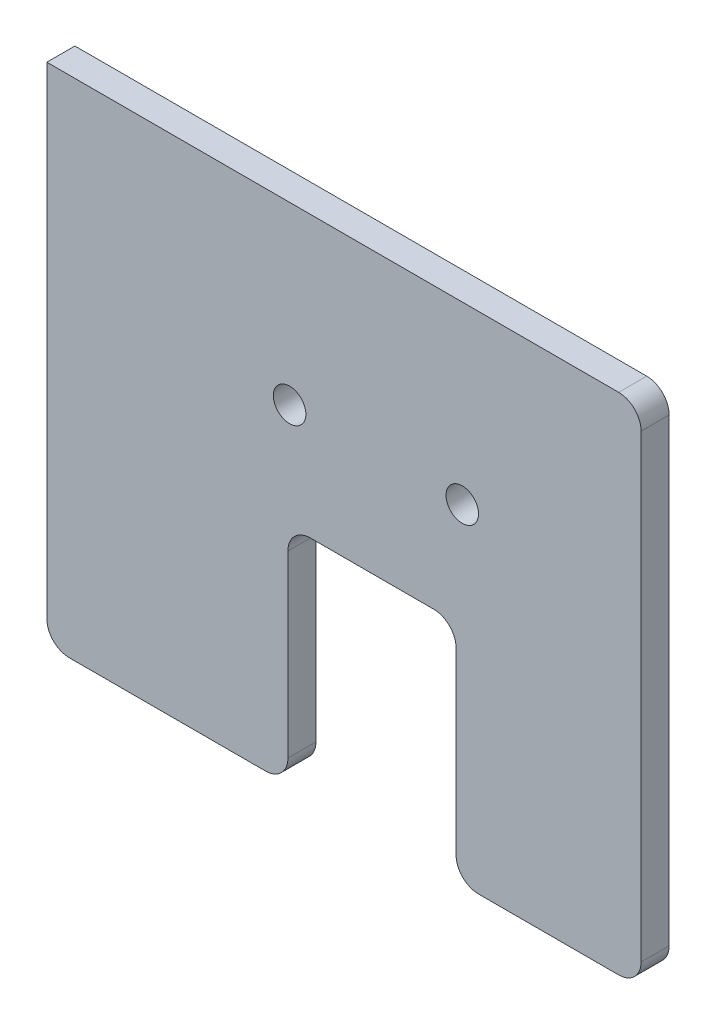
ISO-10303-21;
HEADER;
FILE_DESCRIPTION(('STEP AP214'),'2;1');
FILE_NAME('part.step','',(''),(''),'','','');
FILE_SCHEMA(('AUTOMOTIVE_DESIGN { 1 0 10303 214 1 1 1 1 }'));
ENDSEC;
DATA;
#1=APPLICATION_CONTEXT('core data for automotive mechanical design processes');
#2=APPLICATION_PROTOCOL_DEFINITION('international standard','automotive_design',2000,#1);
#3=PRODUCT_CONTEXT('',#1,'mechanical');
#4=PRODUCT('Part','Part','',(#3));
#5=PRODUCT_RELATED_PRODUCT_CATEGORY('part','',(#4));
#6=PRODUCT_DEFINITION_FORMATION('','',#4);
#7=PRODUCT_DEFINITION_CONTEXT('part definition',#1,'design');
#8=PRODUCT_DEFINITION('design','',#6,#7);
#9=PRODUCT_DEFINITION_SHAPE('','',#8);
#10=(LENGTH_UNIT() NAMED_UNIT(*) SI_UNIT(.MILLI.,.METRE.));
#11=(NAMED_UNIT(*) PLANE_ANGLE_UNIT() SI_UNIT($,.RADIAN.));
#12=(NAMED_UNIT(*) SI_UNIT($,.STERADIAN.) SOLID_ANGLE_UNIT());
#13=UNCERTAINTY_MEASURE_WITH_UNIT(LENGTH_MEASURE(1.E-05),#10,'distance_accuracy_value','');
#14=(GEOMETRIC_REPRESENTATION_CONTEXT(3) GLOBAL_UNCERTAINTY_ASSIGNED_CONTEXT((#13)) GLOBAL_UNIT_ASSIGNED_CONTEXT((#10,
#11,#12)) REPRESENTATION_CONTEXT('',''));
#15=CARTESIAN_POINT('',(0.,0.,0.));
#16=DIRECTION('',(0.,0.,1.));
#17=DIRECTION('',(1.,0.,0.));
#18=AXIS2_PLACEMENT_3D('',#15,#16,#17);
#19=CARTESIAN_POINT('',(21.5,0.,2.5));
#20=DIRECTION('',(0.,1.,0.));
#21=DIRECTION('',(-1.,0.,0.));
#22=AXIS2_PLACEMENT_3D('',#19,#20,#21);
#23=PLANE('',#22);
#24=DIRECTION('',(1.,0.,0.));
#25=VECTOR('',#24,1.);
#26=CARTESIAN_POINT('',(21.5,0.,2.5));
#27=LINE('',#26,#25);
#28=CARTESIAN_POINT('',(2.,0.,2.5));
#29=VERTEX_POINT('',#28);
#30=CARTESIAN_POINT('',(19.5,0.,2.5));
#31=VERTEX_POINT('',#30);
#32=EDGE_CURVE('E210',#29,#31,#27,.T.);
#33=ORIENTED_EDGE('',*,*,#32,.F.);
#34=DIRECTION('',(0.,0.,-1.));
#35=VECTOR('',#34,1.);
#36=CARTESIAN_POINT('',(2.,0.,2.5));
#37=LINE('',#36,#35);
#38=CARTESIAN_POINT('',(2.,0.,0.));
#39=VERTEX_POINT('',#38);
#40=EDGE_CURVE('E214',#29,#39,#37,.T.);
#41=ORIENTED_EDGE('',*,*,#40,.T.);
#42=DIRECTION('',(1.,0.,0.));
#43=VECTOR('',#42,1.);
#44=CARTESIAN_POINT('',(21.5,0.,0.));
#45=LINE('',#44,#43);
#46=CARTESIAN_POINT('',(19.5,0.,0.));
#47=VERTEX_POINT('',#46);
#48=EDGE_CURVE('E182',#39,#47,#45,.T.);
#49=ORIENTED_EDGE('',*,*,#48,.T.);
#50=DIRECTION('',(0.,0.,-1.));
#51=VECTOR('',#50,1.);
#52=CARTESIAN_POINT('',(19.5,0.,2.5));
#53=LINE('',#52,#51);
#54=EDGE_CURVE('E173',#47,#31,#53,.F.);
#55=ORIENTED_EDGE('',*,*,#54,.T.);
#56=EDGE_LOOP('',(#33,#41,#49,#55));
#57=FACE_BOUND('',#56,.T.);
#58=ADVANCED_FACE('F45',(#57),#23,.F.);
#59=CARTESIAN_POINT('',(21.5,20.,2.5));
#60=DIRECTION('',(-1.,0.,0.));
#61=DIRECTION('',(0.,0.,1.));
#62=AXIS2_PLACEMENT_3D('',#59,#60,#61);
#63=PLANE('',#62);
#64=DIRECTION('',(0.,1.,0.));
#65=VECTOR('',#64,1.);
#66=CARTESIAN_POINT('',(21.5,20.,2.5));
#67=LINE('',#66,#65);
#68=CARTESIAN_POINT('',(21.5,1.99999999999999,2.5));
#69=VERTEX_POINT('',#68);
#70=CARTESIAN_POINT('',(21.5,18.,2.5));
#71=VERTEX_POINT('',#70);
#72=EDGE_CURVE('E310',#69,#71,#67,.T.);
#73=ORIENTED_EDGE('',*,*,#72,.F.);
#74=DIRECTION('',(0.,0.,-1.));
#75=VECTOR('',#74,1.);
#76=CARTESIAN_POINT('',(21.5,1.99999999999999,2.5));
#77=LINE('',#76,#75);
#78=CARTESIAN_POINT('',(21.5,1.99999999999999,0.));
#79=VERTEX_POINT('',#78);
#80=EDGE_CURVE('E268',#69,#79,#77,.T.);
#81=ORIENTED_EDGE('',*,*,#80,.T.);
#82=DIRECTION('',(0.,1.,0.));
#83=VECTOR('',#82,1.);
#84=CARTESIAN_POINT('',(21.5,20.,0.));
#85=LINE('',#84,#83);
#86=CARTESIAN_POINT('',(21.5,18.,0.));
#87=VERTEX_POINT('',#86);
#88=EDGE_CURVE('E186',#79,#87,#85,.T.);
#89=ORIENTED_EDGE('',*,*,#88,.T.);
#90=DIRECTION('',(0.,0.,-1.));
#91=VECTOR('',#90,1.);
#92=CARTESIAN_POINT('',(21.5,18.,2.5));
#93=LINE('',#92,#91);
#94=EDGE_CURVE('E265',#87,#71,#93,.F.);
#95=ORIENTED_EDGE('',*,*,#94,.T.);
#96=EDGE_LOOP('',(#73,#81,#89,#95));
#97=FACE_BOUND('',#96,.T.);
#98=ADVANCED_FACE('F302',(#97),#63,.F.);
#99=CARTESIAN_POINT('',(36.5,20.,2.5));
#100=DIRECTION('',(0.,1.,0.));
#101=DIRECTION('',(-1.,0.,0.));
#102=AXIS2_PLACEMENT_3D('',#99,#100,#101);
#103=PLANE('',#102);
#104=DIRECTION('',(1.,0.,0.));
#105=VECTOR('',#104,1.);
#106=CARTESIAN_POINT('',(36.5,20.,0.));
#107=LINE('',#106,#105);
#108=CARTESIAN_POINT('',(23.5,20.,0.));
#109=VERTEX_POINT('',#108);
#110=CARTESIAN_POINT('',(34.5,20.,0.));
#111=VERTEX_POINT('',#110);
#112=EDGE_CURVE('E191',#109,#111,#107,.T.);
#113=ORIENTED_EDGE('',*,*,#112,.T.);
#114=DIRECTION('',(0.,0.,-1.));
#115=VECTOR('',#114,1.);
#116=CARTESIAN_POINT('',(34.5,20.,2.5));
#117=LINE('',#116,#115);
#118=CARTESIAN_POINT('',(34.5,20.,2.5));
#119=VERTEX_POINT('',#118);
#120=EDGE_CURVE('E283',#111,#119,#117,.F.);
#121=ORIENTED_EDGE('',*,*,#120,.T.);
#122=DIRECTION('',(1.,0.,0.));
#123=VECTOR('',#122,1.);
#124=CARTESIAN_POINT('',(36.5,20.,2.5));
#125=LINE('',#124,#123);
#126=CARTESIAN_POINT('',(23.5,20.,2.5));
#127=VERTEX_POINT('',#126);
#128=EDGE_CURVE('E308',#127,#119,#125,.T.);
#129=ORIENTED_EDGE('',*,*,#128,.F.);
#130=DIRECTION('',(0.,0.,-1.));
#131=VECTOR('',#130,1.);
#132=CARTESIAN_POINT('',(23.5,20.,0.));
#133=LINE('',#132,#131);
#134=EDGE_CURVE('E279',#127,#109,#133,.T.);
#135=ORIENTED_EDGE('',*,*,#134,.T.);
#136=EDGE_LOOP('',(#113,#121,#129,#135));
#137=FACE_BOUND('',#136,.T.);
#138=ADVANCED_FACE('F312',(#137),#103,.F.);
#139=CARTESIAN_POINT('',(36.5,0.,2.5));
#140=DIRECTION('',(1.,0.,0.));
#141=DIRECTION('',(0.,0.,-1.));
#142=AXIS2_PLACEMENT_3D('',#139,#140,#141);
#143=PLANE('',#142);
#144=DIRECTION('',(0.,-1.,0.));
#145=VECTOR('',#144,1.);
#146=CARTESIAN_POINT('',(36.5,0.,0.));
#147=LINE('',#146,#145);
#148=CARTESIAN_POINT('',(36.5,18.,0.));
#149=VERTEX_POINT('',#148);
#150=CARTESIAN_POINT('',(36.5,2.,0.));
#151=VERTEX_POINT('',#150);
#152=EDGE_CURVE('E195',#149,#151,#147,.T.);
#153=ORIENTED_EDGE('',*,*,#152,.T.);
#154=DIRECTION('',(0.,0.,-1.));
#155=VECTOR('',#154,1.);
#156=CARTESIAN_POINT('',(36.5,2.,2.5));
#157=LINE('',#156,#155);
#158=CARTESIAN_POINT('',(36.5,2.,2.5));
#159=VERTEX_POINT('',#158);
#160=EDGE_CURVE('E276',#151,#159,#157,.F.);
#161=ORIENTED_EDGE('',*,*,#160,.T.);
#162=DIRECTION('',(0.,-1.,0.));
#163=VECTOR('',#162,1.);
#164=CARTESIAN_POINT('',(36.5,0.,2.5));
#165=LINE('',#164,#163);
#166=CARTESIAN_POINT('',(36.5,18.,2.5));
#167=VERTEX_POINT('',#166);
#168=EDGE_CURVE('E315',#167,#159,#165,.T.);
#169=ORIENTED_EDGE('',*,*,#168,.F.);
#170=DIRECTION('',(0.,0.,-1.));
#171=VECTOR('',#170,1.);
#172=CARTESIAN_POINT('',(36.5,18.,0.));
#173=LINE('',#172,#171);
#174=EDGE_CURVE('E272',#167,#149,#173,.T.);
#175=ORIENTED_EDGE('',*,*,#174,.T.);
#176=EDGE_LOOP('',(#153,#161,#169,#175));
#177=FACE_BOUND('',#176,.T.);
#178=ADVANCED_FACE('F414',(#177),#143,.F.);
#179=CARTESIAN_POINT('',(53.,0.,2.5));
#180=DIRECTION('',(0.,1.,0.));
#181=DIRECTION('',(-1.,0.,0.));
#182=AXIS2_PLACEMENT_3D('',#179,#180,#181);
#183=PLANE('',#182);
#184=DIRECTION('',(1.,0.,0.));
#185=VECTOR('',#184,1.);
#186=CARTESIAN_POINT('',(53.,0.,0.));
#187=LINE('',#186,#185);
#188=CARTESIAN_POINT('',(38.5,0.,0.));
#189=VERTEX_POINT('',#188);
#190=CARTESIAN_POINT('',(51.,0.,0.));
#191=VERTEX_POINT('',#190);
#192=EDGE_CURVE('E199',#189,#191,#187,.T.);
#193=ORIENTED_EDGE('',*,*,#192,.T.);
#194=DIRECTION('',(0.,0.,-1.));
#195=VECTOR('',#194,1.);
#196=CARTESIAN_POINT('',(51.,0.,2.5));
#197=LINE('',#196,#195);
#198=CARTESIAN_POINT('',(51.,0.,2.5));
#199=VERTEX_POINT('',#198);
#200=EDGE_CURVE('E262',#191,#199,#197,.F.);
#201=ORIENTED_EDGE('',*,*,#200,.T.);
#202=DIRECTION('',(1.,0.,0.));
#203=VECTOR('',#202,1.);
#204=CARTESIAN_POINT('',(53.,0.,2.5));
#205=LINE('',#204,#203);
#206=CARTESIAN_POINT('',(38.5,0.,2.5));
#207=VERTEX_POINT('',#206);
#208=EDGE_CURVE('E320',#207,#199,#205,.T.);
#209=ORIENTED_EDGE('',*,*,#208,.F.);
#210=DIRECTION('',(0.,0.,-1.));
#211=VECTOR('',#210,1.);
#212=CARTESIAN_POINT('',(38.5,0.,2.5));
#213=LINE('',#212,#211);
#214=EDGE_CURVE('E258',#207,#189,#213,.T.);
#215=ORIENTED_EDGE('',*,*,#214,.T.);
#216=EDGE_LOOP('',(#193,#201,#209,#215));
#217=FACE_BOUND('',#216,.T.);
#218=ADVANCED_FACE('F420',(#217),#183,.F.);
#219=CARTESIAN_POINT('',(53.,45.,2.5));
#220=DIRECTION('',(-1.,0.,0.));
#221=DIRECTION('',(0.,0.,1.));
#222=AXIS2_PLACEMENT_3D('',#219,#220,#221);
#223=PLANE('',#222);
#224=DIRECTION('',(0.,1.,0.));
#225=VECTOR('',#224,1.);
#226=CARTESIAN_POINT('',(53.,45.,0.));
#227=LINE('',#226,#225);
#228=CARTESIAN_POINT('',(53.,2.00000000000002,0.));
#229=VERTEX_POINT('',#228);
#230=CARTESIAN_POINT('',(53.,43.,0.));
#231=VERTEX_POINT('',#230);
#232=EDGE_CURVE('E203',#229,#231,#227,.T.);
#233=ORIENTED_EDGE('',*,*,#232,.T.);
#234=DIRECTION('',(0.,0.,-1.));
#235=VECTOR('',#234,1.);
#236=CARTESIAN_POINT('',(53.,43.,2.5));
#237=LINE('',#236,#235);
#238=CARTESIAN_POINT('',(53.,43.,2.5));
#239=VERTEX_POINT('',#238);
#240=EDGE_CURVE('E69',#231,#239,#237,.F.);
#241=ORIENTED_EDGE('',*,*,#240,.T.);
#242=DIRECTION('',(0.,1.,0.));
#243=VECTOR('',#242,1.);
#244=CARTESIAN_POINT('',(53.,45.,2.5));
#245=LINE('',#244,#243);
#246=CARTESIAN_POINT('',(53.,2.00000000000002,2.5));
#247=VERTEX_POINT('',#246);
#248=EDGE_CURVE('E162',#247,#239,#245,.T.);
#249=ORIENTED_EDGE('',*,*,#248,.F.);
#250=DIRECTION('',(0.,0.,-1.));
#251=VECTOR('',#250,1.);
#252=CARTESIAN_POINT('',(53.,2.,2.5));
#253=LINE('',#252,#251);
#254=EDGE_CURVE('E252',#247,#229,#253,.T.);
#255=ORIENTED_EDGE('',*,*,#254,.T.);
#256=EDGE_LOOP('',(#233,#241,#249,#255));
#257=FACE_BOUND('',#256,.T.);
#258=ADVANCED_FACE('F423',(#257),#223,.F.);
#259=CARTESIAN_POINT('',(0.,45.,2.5));
#260=DIRECTION('',(0.,-1.,0.));
#261=DIRECTION('',(0.,0.,-1.));
#262=AXIS2_PLACEMENT_3D('',#259,#260,#261);
#263=PLANE('',#262);
#264=DIRECTION('',(-1.,0.,0.));
#265=VECTOR('',#264,1.);
#266=CARTESIAN_POINT('',(0.,45.,2.5));
#267=LINE('',#266,#265);
#268=CARTESIAN_POINT('',(51.,45.,2.5));
#269=VERTEX_POINT('',#268);
#270=CARTESIAN_POINT('',(0.,45.,2.5));
#271=VERTEX_POINT('',#270);
#272=EDGE_CURVE('E152',#269,#271,#267,.T.);
#273=ORIENTED_EDGE('',*,*,#272,.F.);
#274=DIRECTION('',(0.,0.,-1.));
#275=VECTOR('',#274,1.);
#276=CARTESIAN_POINT('',(51.,45.,2.5));
#277=LINE('',#276,#275);
#278=CARTESIAN_POINT('',(51.,45.,0.));
#279=VERTEX_POINT('',#278);
#280=EDGE_CURVE('E249',#269,#279,#277,.T.);
#281=ORIENTED_EDGE('',*,*,#280,.T.);
#282=DIRECTION('',(-1.,0.,0.));
#283=VECTOR('',#282,1.);
#284=CARTESIAN_POINT('',(0.,45.,0.));
#285=LINE('',#284,#283);
#286=CARTESIAN_POINT('',(0.,45.,0.));
#287=VERTEX_POINT('',#286);
#288=EDGE_CURVE('E168',#279,#287,#285,.T.);
#289=ORIENTED_EDGE('',*,*,#288,.T.);
#290=DIRECTION('',(0.,0.,-1.));
#291=VECTOR('',#290,1.);
#292=CARTESIAN_POINT('',(0.,45.,2.5));
#293=LINE('',#292,#291);
#294=EDGE_CURVE('E165',#271,#287,#293,.T.);
#295=ORIENTED_EDGE('',*,*,#294,.F.);
#296=EDGE_LOOP('',(#273,#281,#289,#295));
#297=FACE_BOUND('',#296,.T.);
#298=ADVANCED_FACE('F166',(#297),#263,.F.);
#299=CARTESIAN_POINT('',(0.,0.,2.5));
#300=DIRECTION('',(1.,0.,0.));
#301=DIRECTION('',(0.,0.,-1.));
#302=AXIS2_PLACEMENT_3D('',#299,#300,#301);
#303=PLANE('',#302);
#304=DIRECTION('',(0.,-1.,0.));
#305=VECTOR('',#304,1.);
#306=CARTESIAN_POINT('',(0.,0.,0.));
#307=LINE('',#306,#305);
#308=CARTESIAN_POINT('',(0.,2.,0.));
#309=VERTEX_POINT('',#308);
#310=EDGE_CURVE('E208',#287,#309,#307,.T.);
#311=ORIENTED_EDGE('',*,*,#310,.T.);
#312=DIRECTION('',(0.,0.,-1.));
#313=VECTOR('',#312,1.);
#314=CARTESIAN_POINT('',(0.,2.,2.5));
#315=LINE('',#314,#313);
#316=CARTESIAN_POINT('',(0.,2.,2.5));
#317=VERTEX_POINT('',#316);
#318=EDGE_CURVE('E177',#309,#317,#315,.F.);
#319=ORIENTED_EDGE('',*,*,#318,.T.);
#320=DIRECTION('',(0.,-1.,0.));
#321=VECTOR('',#320,1.);
#322=CARTESIAN_POINT('',(0.,0.,2.5));
#323=LINE('',#322,#321);
#324=EDGE_CURVE('E156',#271,#317,#323,.T.);
#325=ORIENTED_EDGE('',*,*,#324,.F.);
#326=ORIENTED_EDGE('',*,*,#294,.T.);
#327=EDGE_LOOP('',(#311,#319,#325,#326));
#328=FACE_BOUND('',#327,.T.);
#329=ADVANCED_FACE('F175',(#328),#303,.F.);
#330=CARTESIAN_POINT('',(0.,0.,2.5));
#331=DIRECTION('',(0.,0.,-1.));
#332=DIRECTION('',(-1.,0.,0.));
#333=AXIS2_PLACEMENT_3D('',#330,#331,#332);
#334=PLANE('',#333);
#335=CARTESIAN_POINT('',(37.05,29.3545099151734,2.5));
#336=DIRECTION('',(0.,0.,1.));
#337=DIRECTION('',(1.,0.,0.));
#338=AXIS2_PLACEMENT_3D('',#335,#336,#337);
#339=CIRCLE('',#338,1.45);
#340=CARTESIAN_POINT('',(38.5,29.3545099151734,2.5));
#341=VERTEX_POINT('',#340);
#342=EDGE_CURVE('E351',#341,#341,#339,.T.);
#343=ORIENTED_EDGE('',*,*,#342,.F.);
#344=EDGE_LOOP('',(#343));
#345=FACE_BOUND('',#344,.T.);
#346=CARTESIAN_POINT('',(21.65,29.3545099151734,2.5));
#347=DIRECTION('',(0.,0.,1.));
#348=DIRECTION('',(1.,0.,0.));
#349=AXIS2_PLACEMENT_3D('',#346,#347,#348);
#350=CIRCLE('',#349,1.45);
#351=CARTESIAN_POINT('',(23.1,29.3545099151734,2.5));
#352=VERTEX_POINT('',#351);
#353=EDGE_CURVE('E347',#352,#352,#350,.T.);
#354=ORIENTED_EDGE('',*,*,#353,.F.);
#355=EDGE_LOOP('',(#354));
#356=FACE_BOUND('',#355,.T.);
#357=ORIENTED_EDGE('',*,*,#324,.T.);
#358=CARTESIAN_POINT('',(2.,2.,2.5));
#359=DIRECTION('',(0.,0.,-1.));
#360=DIRECTION('',(-1.,0.,0.));
#361=AXIS2_PLACEMENT_3D('',#358,#359,#360);
#362=CIRCLE('',#361,2.);
#363=EDGE_CURVE('E246',#317,#29,#362,.F.);
#364=ORIENTED_EDGE('',*,*,#363,.T.);
#365=ORIENTED_EDGE('',*,*,#32,.T.);
#366=CARTESIAN_POINT('',(19.5,1.99999999999999,2.5));
#367=DIRECTION('',(0.,0.,-1.));
#368=DIRECTION('',(-1.,0.,0.));
#369=AXIS2_PLACEMENT_3D('',#366,#367,#368);
#370=CIRCLE('',#369,2.);
#371=EDGE_CURVE('E238',#31,#69,#370,.F.);
#372=ORIENTED_EDGE('',*,*,#371,.T.);
#373=ORIENTED_EDGE('',*,*,#72,.T.);
#374=CARTESIAN_POINT('',(23.5,18.,2.5));
#375=DIRECTION('',(0.,0.,-1.));
#376=DIRECTION('',(-1.,0.,0.));
#377=AXIS2_PLACEMENT_3D('',#374,#375,#376);
#378=CIRCLE('',#377,2.);
#379=EDGE_CURVE('E11',#71,#127,#378,.T.);
#380=ORIENTED_EDGE('',*,*,#379,.T.);
#381=ORIENTED_EDGE('',*,*,#128,.T.);
#382=CARTESIAN_POINT('',(34.5,18.,2.5));
#383=DIRECTION('',(0.,0.,-1.));
#384=DIRECTION('',(-1.,0.,0.));
#385=AXIS2_PLACEMENT_3D('',#382,#383,#384);
#386=CIRCLE('',#385,2.);
#387=EDGE_CURVE('E289',#119,#167,#386,.T.);
#388=ORIENTED_EDGE('',*,*,#387,.T.);
#389=ORIENTED_EDGE('',*,*,#168,.T.);
#390=CARTESIAN_POINT('',(38.5,2.,2.5));
#391=DIRECTION('',(0.,0.,-1.));
#392=DIRECTION('',(-1.,0.,0.));
#393=AXIS2_PLACEMENT_3D('',#390,#391,#392);
#394=CIRCLE('',#393,2.);
#395=EDGE_CURVE('E235',#159,#207,#394,.F.);
#396=ORIENTED_EDGE('',*,*,#395,.T.);
#397=ORIENTED_EDGE('',*,*,#208,.T.);
#398=CARTESIAN_POINT('',(51.,2.,2.5));
#399=DIRECTION('',(0.,0.,-1.));
#400=DIRECTION('',(-1.,0.,0.));
#401=AXIS2_PLACEMENT_3D('',#398,#399,#400);
#402=CIRCLE('',#401,2.);
#403=EDGE_CURVE('E241',#199,#247,#402,.F.);
#404=ORIENTED_EDGE('',*,*,#403,.T.);
#405=ORIENTED_EDGE('',*,*,#248,.T.);
#406=CARTESIAN_POINT('',(51.,43.,2.5));
#407=DIRECTION('',(0.,0.,-1.));
#408=DIRECTION('',(-1.,0.,0.));
#409=AXIS2_PLACEMENT_3D('',#406,#407,#408);
#410=CIRCLE('',#409,2.);
#411=EDGE_CURVE('E61',#239,#269,#410,.F.);
#412=ORIENTED_EDGE('',*,*,#411,.T.);
#413=ORIENTED_EDGE('',*,*,#272,.T.);
#414=EDGE_LOOP('',(#357,#364,#365,#372,#373,#380,#381,#388,#389,#396,#397,#404,#405,#412,#413));
#415=FACE_BOUND('',#414,.T.);
#416=ADVANCED_FACE('F154',(#345,#356,#415),#334,.F.);
#417=CARTESIAN_POINT('',(0.,0.,0.));
#418=DIRECTION('',(0.,0.,-1.));
#419=DIRECTION('',(-1.,0.,0.));
#420=AXIS2_PLACEMENT_3D('',#417,#418,#419);
#421=PLANE('',#420);
#422=CARTESIAN_POINT('',(37.05,29.3545099151734,0.));
#423=DIRECTION('',(0.,0.,1.));
#424=DIRECTION('',(1.,0.,0.));
#425=AXIS2_PLACEMENT_3D('',#422,#423,#424);
#426=CIRCLE('',#425,1.45);
#427=CARTESIAN_POINT('',(38.5,29.3545099151734,0.));
#428=VERTEX_POINT('',#427);
#429=EDGE_CURVE('E187',#428,#428,#426,.T.);
#430=ORIENTED_EDGE('',*,*,#429,.T.);
#431=EDGE_LOOP('',(#430));
#432=FACE_BOUND('',#431,.T.);
#433=CARTESIAN_POINT('',(21.65,29.3545099151734,0.));
#434=DIRECTION('',(0.,0.,1.));
#435=DIRECTION('',(1.,0.,0.));
#436=AXIS2_PLACEMENT_3D('',#433,#434,#435);
#437=CIRCLE('',#436,1.45);
#438=CARTESIAN_POINT('',(23.1,29.3545099151734,0.));
#439=VERTEX_POINT('',#438);
#440=EDGE_CURVE('E343',#439,#439,#437,.T.);
#441=ORIENTED_EDGE('',*,*,#440,.T.);
#442=EDGE_LOOP('',(#441));
#443=FACE_BOUND('',#442,.T.);
#444=ORIENTED_EDGE('',*,*,#48,.F.);
#445=CARTESIAN_POINT('',(2.,2.,0.));
#446=DIRECTION('',(0.,0.,-1.));
#447=DIRECTION('',(-1.,0.,0.));
#448=AXIS2_PLACEMENT_3D('',#445,#446,#447);
#449=CIRCLE('',#448,2.);
#450=EDGE_CURVE('E230',#39,#309,#449,.T.);
#451=ORIENTED_EDGE('',*,*,#450,.T.);
#452=ORIENTED_EDGE('',*,*,#310,.F.);
#453=ORIENTED_EDGE('',*,*,#288,.F.);
#454=CARTESIAN_POINT('',(51.,43.,0.));
#455=DIRECTION('',(0.,0.,-1.));
#456=DIRECTION('',(-1.,0.,0.));
#457=AXIS2_PLACEMENT_3D('',#454,#455,#456);
#458=CIRCLE('',#457,2.);
#459=EDGE_CURVE('E227',#279,#231,#458,.T.);
#460=ORIENTED_EDGE('',*,*,#459,.T.);
#461=ORIENTED_EDGE('',*,*,#232,.F.);
#462=CARTESIAN_POINT('',(51.,2.,0.));
#463=DIRECTION('',(0.,0.,-1.));
#464=DIRECTION('',(-1.,0.,0.));
#465=AXIS2_PLACEMENT_3D('',#462,#463,#464);
#466=CIRCLE('',#465,2.);
#467=EDGE_CURVE('E224',#229,#191,#466,.T.);
#468=ORIENTED_EDGE('',*,*,#467,.T.);
#469=ORIENTED_EDGE('',*,*,#192,.F.);
#470=CARTESIAN_POINT('',(38.5,2.,0.));
#471=DIRECTION('',(0.,0.,-1.));
#472=DIRECTION('',(-1.,0.,0.));
#473=AXIS2_PLACEMENT_3D('',#470,#471,#472);
#474=CIRCLE('',#473,2.);
#475=EDGE_CURVE('E218',#189,#151,#474,.T.);
#476=ORIENTED_EDGE('',*,*,#475,.T.);
#477=ORIENTED_EDGE('',*,*,#152,.F.);
#478=CARTESIAN_POINT('',(34.5,18.,0.));
#479=DIRECTION('',(0.,0.,-1.));
#480=DIRECTION('',(-1.,0.,0.));
#481=AXIS2_PLACEMENT_3D('',#478,#479,#480);
#482=CIRCLE('',#481,2.);
#483=EDGE_CURVE('E286',#149,#111,#482,.F.);
#484=ORIENTED_EDGE('',*,*,#483,.T.);
#485=ORIENTED_EDGE('',*,*,#112,.F.);
#486=CARTESIAN_POINT('',(23.5,18.,0.));
#487=DIRECTION('',(0.,0.,-1.));
#488=DIRECTION('',(-1.,0.,0.));
#489=AXIS2_PLACEMENT_3D('',#486,#487,#488);
#490=CIRCLE('',#489,2.);
#491=EDGE_CURVE('E54',#109,#87,#490,.F.);
#492=ORIENTED_EDGE('',*,*,#491,.T.);
#493=ORIENTED_EDGE('',*,*,#88,.F.);
#494=CARTESIAN_POINT('',(19.5,1.99999999999999,0.));
#495=DIRECTION('',(0.,0.,-1.));
#496=DIRECTION('',(-1.,0.,0.));
#497=AXIS2_PLACEMENT_3D('',#494,#495,#496);
#498=CIRCLE('',#497,2.);
#499=EDGE_CURVE('E221',#79,#47,#498,.T.);
#500=ORIENTED_EDGE('',*,*,#499,.T.);
#501=EDGE_LOOP('',(#444,#451,#452,#453,#460,#461,#468,#469,#476,#477,#484,#485,#492,#493,#500));
#502=FACE_BOUND('',#501,.T.);
#503=ADVANCED_FACE('F296',(#432,#443,#502),#421,.T.);
#504=CARTESIAN_POINT('',(21.65,29.3545099151734,0.));
#505=DIRECTION('',(0.,0.,1.));
#506=DIRECTION('',(1.,0.,0.));
#507=AXIS2_PLACEMENT_3D('',#504,#505,#506);
#508=CYLINDRICAL_SURFACE('',#507,1.45);
#509=ORIENTED_EDGE('',*,*,#440,.F.);
#510=EDGE_LOOP('',(#509));
#511=FACE_BOUND('',#510,.T.);
#512=ORIENTED_EDGE('',*,*,#353,.T.);
#513=EDGE_LOOP('',(#512));
#514=FACE_BOUND('',#513,.T.);
#515=ADVANCED_FACE('F364',(#511,#514),#508,.F.);
#516=CARTESIAN_POINT('',(37.05,29.3545099151734,0.));
#517=DIRECTION('',(0.,0.,1.));
#518=DIRECTION('',(1.,0.,0.));
#519=AXIS2_PLACEMENT_3D('',#516,#517,#518);
#520=CYLINDRICAL_SURFACE('',#519,1.45);
#521=ORIENTED_EDGE('',*,*,#429,.F.);
#522=EDGE_LOOP('',(#521));
#523=FACE_BOUND('',#522,.T.);
#524=ORIENTED_EDGE('',*,*,#342,.T.);
#525=EDGE_LOOP('',(#524));
#526=FACE_BOUND('',#525,.T.);
#527=ADVANCED_FACE('F361',(#523,#526),#520,.F.);
#528=CARTESIAN_POINT('',(2.,2.,2.5));
#529=DIRECTION('',(0.,0.,-1.));
#530=DIRECTION('',(-1.,0.,0.));
#531=AXIS2_PLACEMENT_3D('',#528,#529,#530);
#532=CYLINDRICAL_SURFACE('',#531,2.);
#533=ORIENTED_EDGE('',*,*,#363,.F.);
#534=ORIENTED_EDGE('',*,*,#318,.F.);
#535=ORIENTED_EDGE('',*,*,#450,.F.);
#536=ORIENTED_EDGE('',*,*,#40,.F.);
#537=EDGE_LOOP('',(#533,#534,#535,#536));
#538=FACE_BOUND('',#537,.T.);
#539=ADVANCED_FACE('F334',(#538),#532,.T.);
#540=CARTESIAN_POINT('',(51.,43.,2.5));
#541=DIRECTION('',(0.,0.,-1.));
#542=DIRECTION('',(-1.,0.,0.));
#543=AXIS2_PLACEMENT_3D('',#540,#541,#542);
#544=CYLINDRICAL_SURFACE('',#543,2.);
#545=ORIENTED_EDGE('',*,*,#411,.F.);
#546=ORIENTED_EDGE('',*,*,#240,.F.);
#547=ORIENTED_EDGE('',*,*,#459,.F.);
#548=ORIENTED_EDGE('',*,*,#280,.F.);
#549=EDGE_LOOP('',(#545,#546,#547,#548));
#550=FACE_BOUND('',#549,.T.);
#551=ADVANCED_FACE('F331',(#550),#544,.T.);
#552=CARTESIAN_POINT('',(51.,2.,2.5));
#553=DIRECTION('',(0.,0.,-1.));
#554=DIRECTION('',(-1.,0.,0.));
#555=AXIS2_PLACEMENT_3D('',#552,#553,#554);
#556=CYLINDRICAL_SURFACE('',#555,2.);
#557=ORIENTED_EDGE('',*,*,#403,.F.);
#558=ORIENTED_EDGE('',*,*,#200,.F.);
#559=ORIENTED_EDGE('',*,*,#467,.F.);
#560=ORIENTED_EDGE('',*,*,#254,.F.);
#561=EDGE_LOOP('',(#557,#558,#559,#560));
#562=FACE_BOUND('',#561,.T.);
#563=ADVANCED_FACE('F393',(#562),#556,.T.);
#564=CARTESIAN_POINT('',(19.5,1.99999999999999,2.5));
#565=DIRECTION('',(0.,0.,-1.));
#566=DIRECTION('',(-1.,0.,0.));
#567=AXIS2_PLACEMENT_3D('',#564,#565,#566);
#568=CYLINDRICAL_SURFACE('',#567,2.);
#569=ORIENTED_EDGE('',*,*,#371,.F.);
#570=ORIENTED_EDGE('',*,*,#54,.F.);
#571=ORIENTED_EDGE('',*,*,#499,.F.);
#572=ORIENTED_EDGE('',*,*,#80,.F.);
#573=EDGE_LOOP('',(#569,#570,#571,#572));
#574=FACE_BOUND('',#573,.T.);
#575=ADVANCED_FACE('F396',(#574),#568,.T.);
#576=CARTESIAN_POINT('',(38.5,2.,2.5));
#577=DIRECTION('',(0.,0.,-1.));
#578=DIRECTION('',(-1.,0.,0.));
#579=AXIS2_PLACEMENT_3D('',#576,#577,#578);
#580=CYLINDRICAL_SURFACE('',#579,2.);
#581=ORIENTED_EDGE('',*,*,#395,.F.);
#582=ORIENTED_EDGE('',*,*,#160,.F.);
#583=ORIENTED_EDGE('',*,*,#475,.F.);
#584=ORIENTED_EDGE('',*,*,#214,.F.);
#585=EDGE_LOOP('',(#581,#582,#583,#584));
#586=FACE_BOUND('',#585,.T.);
#587=ADVANCED_FACE('F400',(#586),#580,.T.);
#588=CARTESIAN_POINT('',(34.5,18.,2.5));
#589=DIRECTION('',(0.,0.,1.));
#590=DIRECTION('',(1.,0.,0.));
#591=AXIS2_PLACEMENT_3D('',#588,#589,#590);
#592=CYLINDRICAL_SURFACE('',#591,2.);
#593=ORIENTED_EDGE('',*,*,#387,.F.);
#594=ORIENTED_EDGE('',*,*,#120,.F.);
#595=ORIENTED_EDGE('',*,*,#483,.F.);
#596=ORIENTED_EDGE('',*,*,#174,.F.);
#597=EDGE_LOOP('',(#593,#594,#595,#596));
#598=FACE_BOUND('',#597,.T.);
#599=ADVANCED_FACE('F403',(#598),#592,.F.);
#600=CARTESIAN_POINT('',(23.5,18.,2.5));
#601=DIRECTION('',(0.,0.,1.));
#602=DIRECTION('',(1.,0.,0.));
#603=AXIS2_PLACEMENT_3D('',#600,#601,#602);
#604=CYLINDRICAL_SURFACE('',#603,2.);
#605=ORIENTED_EDGE('',*,*,#379,.F.);
#606=ORIENTED_EDGE('',*,*,#94,.F.);
#607=ORIENTED_EDGE('',*,*,#491,.F.);
#608=ORIENTED_EDGE('',*,*,#134,.F.);
#609=EDGE_LOOP('',(#605,#606,#607,#608));
#610=FACE_BOUND('',#609,.T.);
#611=ADVANCED_FACE('F47',(#610),#604,.F.);
#612=CLOSED_SHELL('',(#58,#98,#138,#178,#218,#258,#298,#329,#416,#503,#515,#527,#539,#551,#563,
#575,#587,#599,#611));
#613=MANIFOLD_SOLID_BREP('B2',#612);
#614=ADVANCED_BREP_SHAPE_REPRESENTATION('',(#18,#613),#14);
#615=SHAPE_DEFINITION_REPRESENTATION(#9,#614);
ENDSEC;
END-ISO-10303-21;
